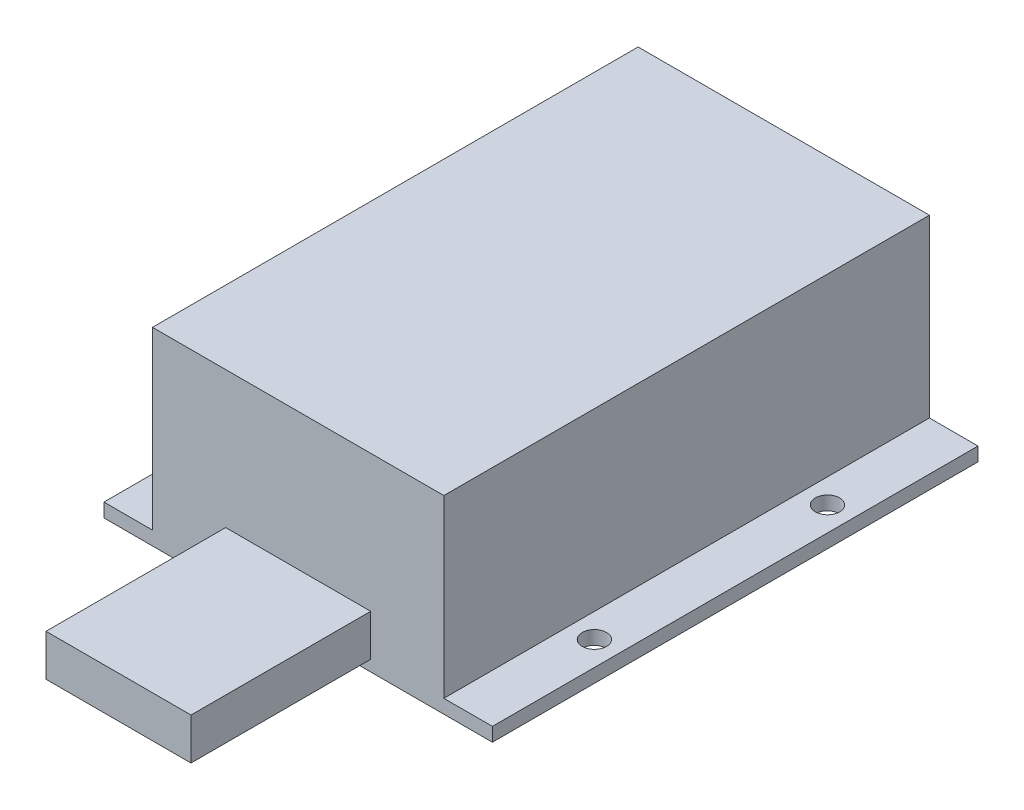
ISO-10303-21;
HEADER;
FILE_DESCRIPTION(('STEP AP214'),'2;1');
FILE_NAME('part.step','',(''),(''),'','','');
FILE_SCHEMA(('AUTOMOTIVE_DESIGN { 1 0 10303 214 1 1 1 1 }'));
ENDSEC;
DATA;
#1=APPLICATION_CONTEXT('core data for automotive mechanical design processes');
#2=APPLICATION_PROTOCOL_DEFINITION('international standard','automotive_design',2000,#1);
#3=PRODUCT_CONTEXT('',#1,'mechanical');
#4=PRODUCT('Part','Part','',(#3));
#5=PRODUCT_RELATED_PRODUCT_CATEGORY('part','',(#4));
#6=PRODUCT_DEFINITION_FORMATION('','',#4);
#7=PRODUCT_DEFINITION_CONTEXT('part definition',#1,'design');
#8=PRODUCT_DEFINITION('design','',#6,#7);
#9=PRODUCT_DEFINITION_SHAPE('','',#8);
#10=(LENGTH_UNIT() NAMED_UNIT(*) SI_UNIT(.MILLI.,.METRE.));
#11=(NAMED_UNIT(*) PLANE_ANGLE_UNIT() SI_UNIT($,.RADIAN.));
#12=(NAMED_UNIT(*) SI_UNIT($,.STERADIAN.) SOLID_ANGLE_UNIT());
#13=UNCERTAINTY_MEASURE_WITH_UNIT(LENGTH_MEASURE(1.E-05),#10,'distance_accuracy_value','');
#14=(GEOMETRIC_REPRESENTATION_CONTEXT(3) GLOBAL_UNCERTAINTY_ASSIGNED_CONTEXT((#13)) GLOBAL_UNIT_ASSIGNED_CONTEXT((#10,
#11,#12)) REPRESENTATION_CONTEXT('',''));
#15=CARTESIAN_POINT('',(0.,0.,0.));
#16=DIRECTION('',(0.,0.,1.));
#17=DIRECTION('',(1.,0.,0.));
#18=AXIS2_PLACEMENT_3D('',#15,#16,#17);
#19=CARTESIAN_POINT('',(0.,0.,50.));
#20=DIRECTION('',(0.,0.,1.));
#21=DIRECTION('',(1.,0.,0.));
#22=AXIS2_PLACEMENT_3D('',#19,#20,#21);
#23=PLANE('',#22);
#24=DIRECTION('',(0.,1.,0.));
#25=VECTOR('',#24,1.);
#26=CARTESIAN_POINT('',(40.,-16.6666666666667,50.));
#27=LINE('',#26,#25);
#28=CARTESIAN_POINT('',(40.,-19.5,50.));
#29=VERTEX_POINT('',#28);
#30=CARTESIAN_POINT('',(40.,-16.6666666666667,50.));
#31=VERTEX_POINT('',#30);
#32=EDGE_CURVE('E166',#29,#31,#27,.T.);
#33=ORIENTED_EDGE('',*,*,#32,.T.);
#34=DIRECTION('',(-1.,0.,0.));
#35=VECTOR('',#34,1.);
#36=CARTESIAN_POINT('',(30.,-16.6666666666667,50.));
#37=LINE('',#36,#35);
#38=CARTESIAN_POINT('',(30.,-16.6666666666667,50.));
#39=VERTEX_POINT('',#38);
#40=EDGE_CURVE('E106',#31,#39,#37,.T.);
#41=ORIENTED_EDGE('',*,*,#40,.T.);
#42=DIRECTION('',(0.,1.,0.));
#43=VECTOR('',#42,1.);
#44=CARTESIAN_POINT('',(30.,19.5,50.));
#45=LINE('',#44,#43);
#46=CARTESIAN_POINT('',(30.,19.5,50.));
#47=VERTEX_POINT('',#46);
#48=EDGE_CURVE('E181',#39,#47,#45,.T.);
#49=ORIENTED_EDGE('',*,*,#48,.T.);
#50=DIRECTION('',(-1.,0.,0.));
#51=VECTOR('',#50,1.);
#52=CARTESIAN_POINT('',(-30.,19.5,50.));
#53=LINE('',#52,#51);
#54=CARTESIAN_POINT('',(-30.,19.5,50.));
#55=VERTEX_POINT('',#54);
#56=EDGE_CURVE('E193',#47,#55,#53,.T.);
#57=ORIENTED_EDGE('',*,*,#56,.T.);
#58=DIRECTION('',(0.,-1.,0.));
#59=VECTOR('',#58,1.);
#60=CARTESIAN_POINT('',(-30.,19.5,50.));
#61=LINE('',#60,#59);
#62=CARTESIAN_POINT('',(-30.,-16.6666666666667,50.));
#63=VERTEX_POINT('',#62);
#64=EDGE_CURVE('E129',#55,#63,#61,.T.);
#65=ORIENTED_EDGE('',*,*,#64,.T.);
#66=DIRECTION('',(-1.,0.,0.));
#67=VECTOR('',#66,1.);
#68=CARTESIAN_POINT('',(-30.,-16.6666666666667,50.));
#69=LINE('',#68,#67);
#70=CARTESIAN_POINT('',(-40.,-16.6666666666667,50.));
#71=VERTEX_POINT('',#70);
#72=EDGE_CURVE('E122',#63,#71,#69,.T.);
#73=ORIENTED_EDGE('',*,*,#72,.T.);
#74=DIRECTION('',(0.,-1.,0.));
#75=VECTOR('',#74,1.);
#76=CARTESIAN_POINT('',(-40.,-16.6666666666667,50.));
#77=LINE('',#76,#75);
#78=CARTESIAN_POINT('',(-40.,-19.5,50.));
#79=VERTEX_POINT('',#78);
#80=EDGE_CURVE('E126',#71,#79,#77,.T.);
#81=ORIENTED_EDGE('',*,*,#80,.T.);
#82=DIRECTION('',(1.,0.,0.));
#83=VECTOR('',#82,1.);
#84=CARTESIAN_POINT('',(-40.,-19.5,50.));
#85=LINE('',#84,#83);
#86=EDGE_CURVE('E65',#79,#29,#85,.T.);
#87=ORIENTED_EDGE('',*,*,#86,.T.);
#88=EDGE_LOOP('',(#33,#41,#49,#57,#65,#73,#81,#87));
#89=FACE_BOUND('',#88,.T.);
#90=DIRECTION('',(-1.,0.,0.));
#91=VECTOR('',#90,1.);
#92=CARTESIAN_POINT('',(-14.931869746895,-8.67732997844512,50.));
#93=LINE('',#92,#91);
#94=CARTESIAN_POINT('',(14.931869746895,-8.67732997844512,50.));
#95=VERTEX_POINT('',#94);
#96=CARTESIAN_POINT('',(-14.931869746895,-8.67732997844512,50.));
#97=VERTEX_POINT('',#96);
#98=EDGE_CURVE('E238',#95,#97,#93,.T.);
#99=ORIENTED_EDGE('',*,*,#98,.F.);
#100=DIRECTION('',(0.,1.,0.));
#101=VECTOR('',#100,1.);
#102=CARTESIAN_POINT('',(14.931869746895,-8.67732997844512,50.));
#103=LINE('',#102,#101);
#104=CARTESIAN_POINT('',(14.931869746895,-17.241196450929,50.));
#105=VERTEX_POINT('',#104);
#106=EDGE_CURVE('E241',#105,#95,#103,.T.);
#107=ORIENTED_EDGE('',*,*,#106,.F.);
#108=DIRECTION('',(1.,0.,0.));
#109=VECTOR('',#108,1.);
#110=CARTESIAN_POINT('',(-14.931869746895,-17.241196450929,50.));
#111=LINE('',#110,#109);
#112=CARTESIAN_POINT('',(-14.931869746895,-17.241196450929,50.));
#113=VERTEX_POINT('',#112);
#114=EDGE_CURVE('E233',#113,#105,#111,.T.);
#115=ORIENTED_EDGE('',*,*,#114,.F.);
#116=DIRECTION('',(0.,-1.,0.));
#117=VECTOR('',#116,1.);
#118=CARTESIAN_POINT('',(-14.931869746895,-8.67732997844512,50.));
#119=LINE('',#118,#117);
#120=EDGE_CURVE('E236',#97,#113,#119,.T.);
#121=ORIENTED_EDGE('',*,*,#120,.F.);
#122=EDGE_LOOP('',(#99,#107,#115,#121));
#123=FACE_BOUND('',#122,.T.);
#124=ADVANCED_FACE('F41',(#89,#123),#23,.T.);
#125=CARTESIAN_POINT('',(40.,-16.6666666666667,50.));
#126=DIRECTION('',(-1.,0.,0.));
#127=DIRECTION('',(0.,-1.,0.));
#128=AXIS2_PLACEMENT_3D('',#125,#126,#127);
#129=PLANE('',#128);
#130=DIRECTION('',(0.,1.,0.));
#131=VECTOR('',#130,1.);
#132=CARTESIAN_POINT('',(40.,-16.6666666666667,-50.));
#133=LINE('',#132,#131);
#134=CARTESIAN_POINT('',(40.,-19.5,-50.));
#135=VERTEX_POINT('',#134);
#136=CARTESIAN_POINT('',(40.,-16.6666666666667,-50.));
#137=VERTEX_POINT('',#136);
#138=EDGE_CURVE('E150',#135,#137,#133,.T.);
#139=ORIENTED_EDGE('',*,*,#138,.T.);
#140=DIRECTION('',(0.,0.,-1.));
#141=VECTOR('',#140,1.);
#142=CARTESIAN_POINT('',(40.,-16.6666666666667,50.));
#143=LINE('',#142,#141);
#144=EDGE_CURVE('E11',#31,#137,#143,.T.);
#145=ORIENTED_EDGE('',*,*,#144,.F.);
#146=ORIENTED_EDGE('',*,*,#32,.F.);
#147=DIRECTION('',(0.,0.,-1.));
#148=VECTOR('',#147,1.);
#149=CARTESIAN_POINT('',(40.,-19.5,50.));
#150=LINE('',#149,#148);
#151=EDGE_CURVE('E146',#29,#135,#150,.T.);
#152=ORIENTED_EDGE('',*,*,#151,.T.);
#153=EDGE_LOOP('',(#139,#145,#146,#152));
#154=FACE_BOUND('',#153,.T.);
#155=ADVANCED_FACE('F43',(#154),#129,.F.);
#156=CARTESIAN_POINT('',(30.,-16.6666666666667,50.));
#157=DIRECTION('',(0.,-1.,0.));
#158=DIRECTION('',(0.,0.,-1.));
#159=AXIS2_PLACEMENT_3D('',#156,#157,#158);
#160=PLANE('',#159);
#161=CARTESIAN_POINT('',(35.,-16.6666666666667,-24.));
#162=DIRECTION('',(0.,1.,0.));
#163=DIRECTION('',(0.,0.,-1.));
#164=AXIS2_PLACEMENT_3D('',#161,#162,#163);
#165=CIRCLE('',#164,2.5);
#166=CARTESIAN_POINT('',(35.,-16.6666666666667,-21.5));
#167=VERTEX_POINT('',#166);
#168=EDGE_CURVE('E202',#167,#167,#165,.T.);
#169=ORIENTED_EDGE('',*,*,#168,.F.);
#170=EDGE_LOOP('',(#169));
#171=FACE_BOUND('',#170,.T.);
#172=CARTESIAN_POINT('',(35.,-16.6666666666667,24.));
#173=DIRECTION('',(0.,1.,0.));
#174=DIRECTION('',(0.,0.,-1.));
#175=AXIS2_PLACEMENT_3D('',#172,#173,#174);
#176=CIRCLE('',#175,2.5);
#177=CARTESIAN_POINT('',(35.,-16.6666666666667,26.5));
#178=VERTEX_POINT('',#177);
#179=EDGE_CURVE('E209',#178,#178,#176,.T.);
#180=ORIENTED_EDGE('',*,*,#179,.F.);
#181=EDGE_LOOP('',(#180));
#182=FACE_BOUND('',#181,.T.);
#183=DIRECTION('',(-1.,0.,0.));
#184=VECTOR('',#183,1.);
#185=CARTESIAN_POINT('',(30.,-16.6666666666667,-50.));
#186=LINE('',#185,#184);
#187=CARTESIAN_POINT('',(30.,-16.6666666666667,-50.));
#188=VERTEX_POINT('',#187);
#189=EDGE_CURVE('E153',#137,#188,#186,.T.);
#190=ORIENTED_EDGE('',*,*,#189,.T.);
#191=DIRECTION('',(0.,0.,-1.));
#192=VECTOR('',#191,1.);
#193=CARTESIAN_POINT('',(30.,-16.6666666666667,50.));
#194=LINE('',#193,#192);
#195=EDGE_CURVE('E49',#39,#188,#194,.T.);
#196=ORIENTED_EDGE('',*,*,#195,.F.);
#197=ORIENTED_EDGE('',*,*,#40,.F.);
#198=ORIENTED_EDGE('',*,*,#144,.T.);
#199=EDGE_LOOP('',(#190,#196,#197,#198));
#200=FACE_BOUND('',#199,.T.);
#201=ADVANCED_FACE('F289',(#171,#182,#200),#160,.F.);
#202=CARTESIAN_POINT('',(30.,19.5,50.));
#203=DIRECTION('',(-1.,0.,0.));
#204=DIRECTION('',(0.,-1.,0.));
#205=AXIS2_PLACEMENT_3D('',#202,#203,#204);
#206=PLANE('',#205);
#207=DIRECTION('',(0.,1.,0.));
#208=VECTOR('',#207,1.);
#209=CARTESIAN_POINT('',(30.,19.5,-50.));
#210=LINE('',#209,#208);
#211=CARTESIAN_POINT('',(30.,19.5,-50.));
#212=VERTEX_POINT('',#211);
#213=EDGE_CURVE('E156',#188,#212,#210,.T.);
#214=ORIENTED_EDGE('',*,*,#213,.T.);
#215=DIRECTION('',(0.,0.,-1.));
#216=VECTOR('',#215,1.);
#217=CARTESIAN_POINT('',(30.,19.5,50.));
#218=LINE('',#217,#216);
#219=EDGE_CURVE('E173',#47,#212,#218,.T.);
#220=ORIENTED_EDGE('',*,*,#219,.F.);
#221=ORIENTED_EDGE('',*,*,#48,.F.);
#222=ORIENTED_EDGE('',*,*,#195,.T.);
#223=EDGE_LOOP('',(#214,#220,#221,#222));
#224=FACE_BOUND('',#223,.T.);
#225=ADVANCED_FACE('F179',(#224),#206,.F.);
#226=CARTESIAN_POINT('',(-30.,19.5,50.));
#227=DIRECTION('',(0.,-1.,0.));
#228=DIRECTION('',(1.,0.,0.));
#229=AXIS2_PLACEMENT_3D('',#226,#227,#228);
#230=PLANE('',#229);
#231=DIRECTION('',(-1.,0.,0.));
#232=VECTOR('',#231,1.);
#233=CARTESIAN_POINT('',(-30.,19.5,-50.));
#234=LINE('',#233,#232);
#235=CARTESIAN_POINT('',(-30.,19.5,-50.));
#236=VERTEX_POINT('',#235);
#237=EDGE_CURVE('E158',#212,#236,#234,.T.);
#238=ORIENTED_EDGE('',*,*,#237,.T.);
#239=DIRECTION('',(0.,0.,-1.));
#240=VECTOR('',#239,1.);
#241=CARTESIAN_POINT('',(-30.,19.5,50.));
#242=LINE('',#241,#240);
#243=EDGE_CURVE('E170',#55,#236,#242,.T.);
#244=ORIENTED_EDGE('',*,*,#243,.F.);
#245=ORIENTED_EDGE('',*,*,#56,.F.);
#246=ORIENTED_EDGE('',*,*,#219,.T.);
#247=EDGE_LOOP('',(#238,#244,#245,#246));
#248=FACE_BOUND('',#247,.T.);
#249=ADVANCED_FACE('F189',(#248),#230,.F.);
#250=CARTESIAN_POINT('',(-30.,19.5,50.));
#251=DIRECTION('',(1.,0.,0.));
#252=DIRECTION('',(0.,0.,-1.));
#253=AXIS2_PLACEMENT_3D('',#250,#251,#252);
#254=PLANE('',#253);
#255=DIRECTION('',(0.,-1.,0.));
#256=VECTOR('',#255,1.);
#257=CARTESIAN_POINT('',(-30.,19.5,-50.));
#258=LINE('',#257,#256);
#259=CARTESIAN_POINT('',(-30.,-16.6666666666667,-50.));
#260=VERTEX_POINT('',#259);
#261=EDGE_CURVE('E160',#236,#260,#258,.T.);
#262=ORIENTED_EDGE('',*,*,#261,.T.);
#263=DIRECTION('',(0.,0.,-1.));
#264=VECTOR('',#263,1.);
#265=CARTESIAN_POINT('',(-30.,-16.6666666666667,50.));
#266=LINE('',#265,#264);
#267=EDGE_CURVE('E141',#63,#260,#266,.T.);
#268=ORIENTED_EDGE('',*,*,#267,.F.);
#269=ORIENTED_EDGE('',*,*,#64,.F.);
#270=ORIENTED_EDGE('',*,*,#243,.T.);
#271=EDGE_LOOP('',(#262,#268,#269,#270));
#272=FACE_BOUND('',#271,.T.);
#273=ADVANCED_FACE('F192',(#272),#254,.F.);
#274=CARTESIAN_POINT('',(-30.,-16.6666666666667,50.));
#275=DIRECTION('',(0.,-1.,0.));
#276=DIRECTION('',(0.,0.,-1.));
#277=AXIS2_PLACEMENT_3D('',#274,#275,#276);
#278=PLANE('',#277);
#279=CARTESIAN_POINT('',(-35.,-16.6666666666667,24.));
#280=DIRECTION('',(0.,1.,0.));
#281=DIRECTION('',(0.,0.,1.));
#282=AXIS2_PLACEMENT_3D('',#279,#280,#281);
#283=CIRCLE('',#282,2.5);
#284=CARTESIAN_POINT('',(-35.,-16.6666666666667,26.5));
#285=VERTEX_POINT('',#284);
#286=EDGE_CURVE('E208',#285,#285,#283,.T.);
#287=ORIENTED_EDGE('',*,*,#286,.F.);
#288=EDGE_LOOP('',(#287));
#289=FACE_BOUND('',#288,.T.);
#290=CARTESIAN_POINT('',(-35.,-16.6666666666667,-24.));
#291=DIRECTION('',(0.,1.,0.));
#292=DIRECTION('',(0.,0.,1.));
#293=AXIS2_PLACEMENT_3D('',#290,#291,#292);
#294=CIRCLE('',#293,2.5);
#295=CARTESIAN_POINT('',(-35.,-16.6666666666667,-21.5));
#296=VERTEX_POINT('',#295);
#297=EDGE_CURVE('E199',#296,#296,#294,.T.);
#298=ORIENTED_EDGE('',*,*,#297,.F.);
#299=EDGE_LOOP('',(#298));
#300=FACE_BOUND('',#299,.T.);
#301=DIRECTION('',(-1.,0.,0.));
#302=VECTOR('',#301,1.);
#303=CARTESIAN_POINT('',(-30.,-16.6666666666667,-50.));
#304=LINE('',#303,#302);
#305=CARTESIAN_POINT('',(-40.,-16.6666666666667,-50.));
#306=VERTEX_POINT('',#305);
#307=EDGE_CURVE('E138',#260,#306,#304,.T.);
#308=ORIENTED_EDGE('',*,*,#307,.T.);
#309=DIRECTION('',(0.,0.,-1.));
#310=VECTOR('',#309,1.);
#311=CARTESIAN_POINT('',(-40.,-16.6666666666667,50.));
#312=LINE('',#311,#310);
#313=EDGE_CURVE('E135',#71,#306,#312,.T.);
#314=ORIENTED_EDGE('',*,*,#313,.F.);
#315=ORIENTED_EDGE('',*,*,#72,.F.);
#316=ORIENTED_EDGE('',*,*,#267,.T.);
#317=EDGE_LOOP('',(#308,#314,#315,#316));
#318=FACE_BOUND('',#317,.T.);
#319=ADVANCED_FACE('F136',(#289,#300,#318),#278,.F.);
#320=CARTESIAN_POINT('',(-40.,-16.6666666666667,50.));
#321=DIRECTION('',(1.,0.,0.));
#322=DIRECTION('',(0.,0.,-1.));
#323=AXIS2_PLACEMENT_3D('',#320,#321,#322);
#324=PLANE('',#323);
#325=DIRECTION('',(0.,-1.,0.));
#326=VECTOR('',#325,1.);
#327=CARTESIAN_POINT('',(-40.,-16.6666666666667,-50.));
#328=LINE('',#327,#326);
#329=CARTESIAN_POINT('',(-40.,-19.5,-50.));
#330=VERTEX_POINT('',#329);
#331=EDGE_CURVE('E163',#306,#330,#328,.T.);
#332=ORIENTED_EDGE('',*,*,#331,.T.);
#333=DIRECTION('',(0.,0.,-1.));
#334=VECTOR('',#333,1.);
#335=CARTESIAN_POINT('',(-40.,-19.5,50.));
#336=LINE('',#335,#334);
#337=EDGE_CURVE('E142',#79,#330,#336,.T.);
#338=ORIENTED_EDGE('',*,*,#337,.F.);
#339=ORIENTED_EDGE('',*,*,#80,.F.);
#340=ORIENTED_EDGE('',*,*,#313,.T.);
#341=EDGE_LOOP('',(#332,#338,#339,#340));
#342=FACE_BOUND('',#341,.T.);
#343=ADVANCED_FACE('F144',(#342),#324,.F.);
#344=CARTESIAN_POINT('',(-40.,-19.5,50.));
#345=DIRECTION('',(0.,1.,0.));
#346=DIRECTION('',(0.,0.,1.));
#347=AXIS2_PLACEMENT_3D('',#344,#345,#346);
#348=PLANE('',#347);
#349=CARTESIAN_POINT('',(35.,-19.5,-24.));
#350=DIRECTION('',(0.,1.,0.));
#351=DIRECTION('',(0.,0.,-1.));
#352=AXIS2_PLACEMENT_3D('',#349,#350,#351);
#353=CIRCLE('',#352,2.5);
#354=CARTESIAN_POINT('',(35.,-19.5,-21.5));
#355=VERTEX_POINT('',#354);
#356=EDGE_CURVE('E212',#355,#355,#353,.T.);
#357=ORIENTED_EDGE('',*,*,#356,.T.);
#358=EDGE_LOOP('',(#357));
#359=FACE_BOUND('',#358,.T.);
#360=CARTESIAN_POINT('',(-35.,-19.5,24.));
#361=DIRECTION('',(0.,1.,0.));
#362=DIRECTION('',(0.,0.,1.));
#363=AXIS2_PLACEMENT_3D('',#360,#361,#362);
#364=CIRCLE('',#363,2.5);
#365=CARTESIAN_POINT('',(-35.,-19.5,26.5));
#366=VERTEX_POINT('',#365);
#367=EDGE_CURVE('E205',#366,#366,#364,.T.);
#368=ORIENTED_EDGE('',*,*,#367,.T.);
#369=EDGE_LOOP('',(#368));
#370=FACE_BOUND('',#369,.T.);
#371=CARTESIAN_POINT('',(35.,-19.5,24.));
#372=DIRECTION('',(0.,1.,0.));
#373=DIRECTION('',(0.,0.,-1.));
#374=AXIS2_PLACEMENT_3D('',#371,#372,#373);
#375=CIRCLE('',#374,2.5);
#376=CARTESIAN_POINT('',(35.,-19.5,26.5));
#377=VERTEX_POINT('',#376);
#378=EDGE_CURVE('E217',#377,#377,#375,.T.);
#379=ORIENTED_EDGE('',*,*,#378,.T.);
#380=EDGE_LOOP('',(#379));
#381=FACE_BOUND('',#380,.T.);
#382=CARTESIAN_POINT('',(-35.,-19.5,-24.));
#383=DIRECTION('',(0.,1.,0.));
#384=DIRECTION('',(0.,0.,1.));
#385=AXIS2_PLACEMENT_3D('',#382,#383,#384);
#386=CIRCLE('',#385,2.5);
#387=CARTESIAN_POINT('',(-35.,-19.5,-21.5));
#388=VERTEX_POINT('',#387);
#389=EDGE_CURVE('E154',#388,#388,#386,.T.);
#390=ORIENTED_EDGE('',*,*,#389,.T.);
#391=EDGE_LOOP('',(#390));
#392=FACE_BOUND('',#391,.T.);
#393=DIRECTION('',(1.,0.,0.));
#394=VECTOR('',#393,1.);
#395=CARTESIAN_POINT('',(-40.,-19.5,-50.));
#396=LINE('',#395,#394);
#397=EDGE_CURVE('E98',#330,#135,#396,.T.);
#398=ORIENTED_EDGE('',*,*,#397,.T.);
#399=ORIENTED_EDGE('',*,*,#151,.F.);
#400=ORIENTED_EDGE('',*,*,#86,.F.);
#401=ORIENTED_EDGE('',*,*,#337,.T.);
#402=EDGE_LOOP('',(#398,#399,#400,#401));
#403=FACE_BOUND('',#402,.T.);
#404=ADVANCED_FACE('F297',(#359,#370,#381,#392,#403),#348,.F.);
#405=CARTESIAN_POINT('',(0.,0.,-50.));
#406=DIRECTION('',(0.,0.,1.));
#407=DIRECTION('',(1.,0.,0.));
#408=AXIS2_PLACEMENT_3D('',#405,#406,#407);
#409=PLANE('',#408);
#410=ORIENTED_EDGE('',*,*,#138,.F.);
#411=ORIENTED_EDGE('',*,*,#397,.F.);
#412=ORIENTED_EDGE('',*,*,#331,.F.);
#413=ORIENTED_EDGE('',*,*,#307,.F.);
#414=ORIENTED_EDGE('',*,*,#261,.F.);
#415=ORIENTED_EDGE('',*,*,#237,.F.);
#416=ORIENTED_EDGE('',*,*,#213,.F.);
#417=ORIENTED_EDGE('',*,*,#189,.F.);
#418=EDGE_LOOP('',(#410,#411,#412,#413,#414,#415,#416,#417));
#419=FACE_BOUND('',#418,.T.);
#420=ADVANCED_FACE('F185',(#419),#409,.F.);
#421=CARTESIAN_POINT('',(-35.,-19.5,-24.));
#422=DIRECTION('',(0.,1.,0.));
#423=DIRECTION('',(0.,0.,1.));
#424=AXIS2_PLACEMENT_3D('',#421,#422,#423);
#425=CYLINDRICAL_SURFACE('',#424,2.5);
#426=CARTESIAN_POINT('',(-35.,-19.5,-21.5));
#427=CARTESIAN_POINT('',(-35.,-19.4704861111111,-21.5));
#428=CARTESIAN_POINT('',(-35.,-19.4409722222222,-21.5));
#429=CARTESIAN_POINT('',(-35.,-19.3819444444444,-21.5));
#430=CARTESIAN_POINT('',(-35.,-19.3524305555556,-21.5));
#431=CARTESIAN_POINT('',(-35.,-19.2934027777778,-21.5));
#432=CARTESIAN_POINT('',(-35.,-19.2638888888889,-21.5));
#433=CARTESIAN_POINT('',(-35.,-19.2048611111111,-21.5));
#434=CARTESIAN_POINT('',(-35.,-19.1753472222222,-21.5));
#435=CARTESIAN_POINT('',(-35.,-19.1163194444444,-21.5));
#436=CARTESIAN_POINT('',(-35.,-19.0868055555556,-21.5));
#437=CARTESIAN_POINT('',(-35.,-19.0277777777778,-21.5));
#438=CARTESIAN_POINT('',(-35.,-18.9982638888889,-21.5));
#439=CARTESIAN_POINT('',(-35.,-18.9392361111111,-21.5));
#440=CARTESIAN_POINT('',(-35.,-18.9097222222222,-21.5));
#441=CARTESIAN_POINT('',(-35.,-18.8506944444444,-21.5));
#442=CARTESIAN_POINT('',(-35.,-18.8211805555556,-21.5));
#443=CARTESIAN_POINT('',(-35.,-18.7621527777778,-21.5));
#444=CARTESIAN_POINT('',(-35.,-18.7326388888889,-21.5));
#445=CARTESIAN_POINT('',(-35.,-18.6736111111111,-21.5));
#446=CARTESIAN_POINT('',(-35.,-18.6440972222222,-21.5));
#447=CARTESIAN_POINT('',(-35.,-18.5850694444444,-21.5));
#448=CARTESIAN_POINT('',(-35.,-18.5555555555556,-21.5));
#449=CARTESIAN_POINT('',(-35.,-18.4965277777778,-21.5));
#450=CARTESIAN_POINT('',(-35.,-18.4670138888889,-21.5));
#451=CARTESIAN_POINT('',(-35.,-18.4079861111111,-21.5));
#452=CARTESIAN_POINT('',(-35.,-18.3784722222222,-21.5));
#453=CARTESIAN_POINT('',(-35.,-18.3194444444444,-21.5));
#454=CARTESIAN_POINT('',(-35.,-18.2899305555556,-21.5));
#455=CARTESIAN_POINT('',(-35.,-18.2309027777778,-21.5));
#456=CARTESIAN_POINT('',(-35.,-18.2013888888889,-21.5));
#457=CARTESIAN_POINT('',(-35.,-18.1423611111111,-21.5));
#458=CARTESIAN_POINT('',(-35.,-18.1128472222222,-21.5));
#459=CARTESIAN_POINT('',(-35.,-18.0538194444444,-21.5));
#460=CARTESIAN_POINT('',(-35.,-18.0243055555556,-21.5));
#461=CARTESIAN_POINT('',(-35.,-17.9652777777778,-21.5));
#462=CARTESIAN_POINT('',(-35.,-17.9357638888889,-21.5));
#463=CARTESIAN_POINT('',(-35.,-17.8767361111111,-21.5));
#464=CARTESIAN_POINT('',(-35.,-17.8472222222222,-21.5));
#465=CARTESIAN_POINT('',(-35.,-17.7881944444444,-21.5));
#466=CARTESIAN_POINT('',(-35.,-17.7586805555556,-21.5));
#467=CARTESIAN_POINT('',(-35.,-17.6996527777778,-21.5));
#468=CARTESIAN_POINT('',(-35.,-17.6701388888889,-21.5));
#469=CARTESIAN_POINT('',(-35.,-17.6111111111111,-21.5));
#470=CARTESIAN_POINT('',(-35.,-17.5815972222222,-21.5));
#471=CARTESIAN_POINT('',(-35.,-17.5225694444444,-21.5));
#472=CARTESIAN_POINT('',(-35.,-17.4930555555556,-21.5));
#473=CARTESIAN_POINT('',(-35.,-17.4340277777778,-21.5));
#474=CARTESIAN_POINT('',(-35.,-17.4045138888889,-21.5));
#475=CARTESIAN_POINT('',(-35.,-17.3454861111111,-21.5));
#476=CARTESIAN_POINT('',(-35.,-17.3159722222222,-21.5));
#477=CARTESIAN_POINT('',(-35.,-17.2569444444444,-21.5));
#478=CARTESIAN_POINT('',(-35.,-17.2274305555556,-21.5));
#479=CARTESIAN_POINT('',(-35.,-17.1684027777778,-21.5));
#480=CARTESIAN_POINT('',(-35.,-17.1388888888889,-21.5));
#481=CARTESIAN_POINT('',(-35.,-17.0798611111111,-21.5));
#482=CARTESIAN_POINT('',(-35.,-17.0503472222222,-21.5));
#483=CARTESIAN_POINT('',(-35.,-16.9913194444444,-21.5));
#484=CARTESIAN_POINT('',(-35.,-16.9618055555556,-21.5));
#485=CARTESIAN_POINT('',(-35.,-16.9027777777778,-21.5));
#486=CARTESIAN_POINT('',(-35.,-16.8732638888889,-21.5));
#487=CARTESIAN_POINT('',(-35.,-16.8142361111111,-21.5));
#488=CARTESIAN_POINT('',(-35.,-16.7847222222222,-21.5));
#489=CARTESIAN_POINT('',(-35.,-16.7256944444445,-21.5));
#490=CARTESIAN_POINT('',(-35.,-16.6961805555556,-21.5));
#491=CARTESIAN_POINT('',(-35.,-16.6666666666667,-21.5));
#492=B_SPLINE_CURVE_WITH_KNOTS('',3,(#426,#427,#428,#429,#430,#431,#432,#433,#434,#435,#436,
#437,#438,#439,#440,#441,#442,#443,#444,#445,#446,#447,#448,#449,#450,#451,#452,#453,#454,#455,
#456,#457,#458,#459,#460,#461,#462,#463,#464,#465,#466,#467,#468,#469,#470,#471,#472,#473,#474,
#475,#476,#477,#478,#479,#480,#481,#482,#483,#484,#485,#486,#487,#488,#489,#490,#491),
.UNSPECIFIED.,.F.,.F.,(4,2,2,2,2,2,2,2,2,2,2,2,2,2,2,2,2,2,2,2,2,2,2,2,2,2,2,2,2,2,2,2,4),(0.,
0.0885416666666639,0.177083333333331,0.265624999999999,0.354166666666662,0.44270833333333,
0.531249999999997,0.619791666666664,0.708333333333328,0.796874999999996,0.885416666666663,
0.973958333333327,1.06249999999999,1.15104166666666,1.23958333333333,1.32812499999999,
1.41666666666666,1.50520833333333,1.59374999999999,1.68229166666666,1.77083333333333,
1.85937499999999,1.94791666666666,2.03645833333332,2.12499999999999,2.21354166666666,
2.30208333333332,2.39062499999999,2.47916666666666,2.56770833333332,2.65624999999999,
2.74479166666666,2.83333333333332),.UNSPECIFIED.);
#493=EDGE_CURVE('BSEAM293',#388,#296,#492,.T.);
#494=ORIENTED_EDGE('',*,*,#389,.F.);
#495=ORIENTED_EDGE('',*,*,#297,.T.);
#496=ORIENTED_EDGE('',*,*,#493,.T.);
#497=ORIENTED_EDGE('',*,*,#493,.F.);
#498=EDGE_LOOP('',(#494,#496,#495,#497));
#499=FACE_BOUND('',#498,.T.);
#500=ADVANCED_FACE('F293',(#499),#425,.F.);
#501=CARTESIAN_POINT('',(35.,-19.5,24.));
#502=DIRECTION('',(0.,1.,0.));
#503=DIRECTION('',(0.,0.,1.));
#504=AXIS2_PLACEMENT_3D('',#501,#502,#503);
#505=CYLINDRICAL_SURFACE('',#504,2.5);
#506=CARTESIAN_POINT('',(35.,-19.5,26.5));
#507=CARTESIAN_POINT('',(35.,-19.4704861111111,26.5));
#508=CARTESIAN_POINT('',(35.,-19.4409722222222,26.5));
#509=CARTESIAN_POINT('',(35.,-19.3819444444444,26.5));
#510=CARTESIAN_POINT('',(35.,-19.3524305555556,26.5));
#511=CARTESIAN_POINT('',(35.,-19.2934027777778,26.5));
#512=CARTESIAN_POINT('',(35.,-19.2638888888889,26.5));
#513=CARTESIAN_POINT('',(35.,-19.2048611111111,26.5));
#514=CARTESIAN_POINT('',(35.,-19.1753472222222,26.5));
#515=CARTESIAN_POINT('',(35.,-19.1163194444444,26.5));
#516=CARTESIAN_POINT('',(35.,-19.0868055555556,26.5));
#517=CARTESIAN_POINT('',(35.,-19.0277777777778,26.5));
#518=CARTESIAN_POINT('',(35.,-18.9982638888889,26.5));
#519=CARTESIAN_POINT('',(35.,-18.9392361111111,26.5));
#520=CARTESIAN_POINT('',(35.,-18.9097222222222,26.5));
#521=CARTESIAN_POINT('',(35.,-18.8506944444444,26.5));
#522=CARTESIAN_POINT('',(35.,-18.8211805555556,26.5));
#523=CARTESIAN_POINT('',(35.,-18.7621527777778,26.5));
#524=CARTESIAN_POINT('',(35.,-18.7326388888889,26.5));
#525=CARTESIAN_POINT('',(35.,-18.6736111111111,26.5));
#526=CARTESIAN_POINT('',(35.,-18.6440972222222,26.5));
#527=CARTESIAN_POINT('',(35.,-18.5850694444444,26.5));
#528=CARTESIAN_POINT('',(35.,-18.5555555555556,26.5));
#529=CARTESIAN_POINT('',(35.,-18.4965277777778,26.5));
#530=CARTESIAN_POINT('',(35.,-18.4670138888889,26.5));
#531=CARTESIAN_POINT('',(35.,-18.4079861111111,26.5));
#532=CARTESIAN_POINT('',(35.,-18.3784722222222,26.5));
#533=CARTESIAN_POINT('',(35.,-18.3194444444444,26.5));
#534=CARTESIAN_POINT('',(35.,-18.2899305555556,26.5));
#535=CARTESIAN_POINT('',(35.,-18.2309027777778,26.5));
#536=CARTESIAN_POINT('',(35.,-18.2013888888889,26.5));
#537=CARTESIAN_POINT('',(35.,-18.1423611111111,26.5));
#538=CARTESIAN_POINT('',(35.,-18.1128472222222,26.5));
#539=CARTESIAN_POINT('',(35.,-18.0538194444444,26.5));
#540=CARTESIAN_POINT('',(35.,-18.0243055555556,26.5));
#541=CARTESIAN_POINT('',(35.,-17.9652777777778,26.5));
#542=CARTESIAN_POINT('',(35.,-17.9357638888889,26.5));
#543=CARTESIAN_POINT('',(35.,-17.8767361111111,26.5));
#544=CARTESIAN_POINT('',(35.,-17.8472222222222,26.5));
#545=CARTESIAN_POINT('',(35.,-17.7881944444444,26.5));
#546=CARTESIAN_POINT('',(35.,-17.7586805555556,26.5));
#547=CARTESIAN_POINT('',(35.,-17.6996527777778,26.5));
#548=CARTESIAN_POINT('',(35.,-17.6701388888889,26.5));
#549=CARTESIAN_POINT('',(35.,-17.6111111111111,26.5));
#550=CARTESIAN_POINT('',(35.,-17.5815972222222,26.5));
#551=CARTESIAN_POINT('',(35.,-17.5225694444444,26.5));
#552=CARTESIAN_POINT('',(35.,-17.4930555555556,26.5));
#553=CARTESIAN_POINT('',(35.,-17.4340277777778,26.5));
#554=CARTESIAN_POINT('',(35.,-17.4045138888889,26.5));
#555=CARTESIAN_POINT('',(35.,-17.3454861111111,26.5));
#556=CARTESIAN_POINT('',(35.,-17.3159722222222,26.5));
#557=CARTESIAN_POINT('',(35.,-17.2569444444444,26.5));
#558=CARTESIAN_POINT('',(35.,-17.2274305555556,26.5));
#559=CARTESIAN_POINT('',(35.,-17.1684027777778,26.5));
#560=CARTESIAN_POINT('',(35.,-17.1388888888889,26.5));
#561=CARTESIAN_POINT('',(35.,-17.0798611111111,26.5));
#562=CARTESIAN_POINT('',(35.,-17.0503472222222,26.5));
#563=CARTESIAN_POINT('',(35.,-16.9913194444444,26.5));
#564=CARTESIAN_POINT('',(35.,-16.9618055555556,26.5));
#565=CARTESIAN_POINT('',(35.,-16.9027777777778,26.5));
#566=CARTESIAN_POINT('',(35.,-16.8732638888889,26.5));
#567=CARTESIAN_POINT('',(35.,-16.8142361111111,26.5));
#568=CARTESIAN_POINT('',(35.,-16.7847222222222,26.5));
#569=CARTESIAN_POINT('',(35.,-16.7256944444445,26.5));
#570=CARTESIAN_POINT('',(35.,-16.6961805555556,26.5));
#571=CARTESIAN_POINT('',(35.,-16.6666666666667,26.5));
#572=B_SPLINE_CURVE_WITH_KNOTS('',3,(#506,#507,#508,#509,#510,#511,#512,#513,#514,#515,#516,
#517,#518,#519,#520,#521,#522,#523,#524,#525,#526,#527,#528,#529,#530,#531,#532,#533,#534,#535,
#536,#537,#538,#539,#540,#541,#542,#543,#544,#545,#546,#547,#548,#549,#550,#551,#552,#553,#554,
#555,#556,#557,#558,#559,#560,#561,#562,#563,#564,#565,#566,#567,#568,#569,#570,#571),
.UNSPECIFIED.,.F.,.F.,(4,2,2,2,2,2,2,2,2,2,2,2,2,2,2,2,2,2,2,2,2,2,2,2,2,2,2,2,2,2,2,2,4),(0.,
0.0885416666666639,0.177083333333331,0.265624999999999,0.354166666666662,0.44270833333333,
0.531249999999997,0.619791666666664,0.708333333333328,0.796874999999996,0.885416666666663,
0.973958333333327,1.06249999999999,1.15104166666666,1.23958333333333,1.32812499999999,
1.41666666666666,1.50520833333333,1.59374999999999,1.68229166666666,1.77083333333333,
1.85937499999999,1.94791666666666,2.03645833333332,2.12499999999999,2.21354166666666,
2.30208333333332,2.39062499999999,2.47916666666666,2.56770833333332,2.65624999999999,
2.74479166666666,2.83333333333332),.UNSPECIFIED.);
#573=EDGE_CURVE('BSEAM321',#377,#178,#572,.T.);
#574=ORIENTED_EDGE('',*,*,#378,.F.);
#575=ORIENTED_EDGE('',*,*,#179,.T.);
#576=ORIENTED_EDGE('',*,*,#573,.T.);
#577=ORIENTED_EDGE('',*,*,#573,.F.);
#578=EDGE_LOOP('',(#574,#576,#575,#577));
#579=FACE_BOUND('',#578,.T.);
#580=ADVANCED_FACE('F321',(#579),#505,.F.);
#581=CARTESIAN_POINT('',(-35.,-19.5,24.));
#582=DIRECTION('',(0.,1.,0.));
#583=DIRECTION('',(0.,0.,1.));
#584=AXIS2_PLACEMENT_3D('',#581,#582,#583);
#585=CYLINDRICAL_SURFACE('',#584,2.5);
#586=CARTESIAN_POINT('',(-35.,-19.5,26.5));
#587=CARTESIAN_POINT('',(-35.,-19.4704861111111,26.5));
#588=CARTESIAN_POINT('',(-35.,-19.4409722222222,26.5));
#589=CARTESIAN_POINT('',(-35.,-19.3819444444444,26.5));
#590=CARTESIAN_POINT('',(-35.,-19.3524305555556,26.5));
#591=CARTESIAN_POINT('',(-35.,-19.2934027777778,26.5));
#592=CARTESIAN_POINT('',(-35.,-19.2638888888889,26.5));
#593=CARTESIAN_POINT('',(-35.,-19.2048611111111,26.5));
#594=CARTESIAN_POINT('',(-35.,-19.1753472222222,26.5));
#595=CARTESIAN_POINT('',(-35.,-19.1163194444444,26.5));
#596=CARTESIAN_POINT('',(-35.,-19.0868055555556,26.5));
#597=CARTESIAN_POINT('',(-35.,-19.0277777777778,26.5));
#598=CARTESIAN_POINT('',(-35.,-18.9982638888889,26.5));
#599=CARTESIAN_POINT('',(-35.,-18.9392361111111,26.5));
#600=CARTESIAN_POINT('',(-35.,-18.9097222222222,26.5));
#601=CARTESIAN_POINT('',(-35.,-18.8506944444444,26.5));
#602=CARTESIAN_POINT('',(-35.,-18.8211805555556,26.5));
#603=CARTESIAN_POINT('',(-35.,-18.7621527777778,26.5));
#604=CARTESIAN_POINT('',(-35.,-18.7326388888889,26.5));
#605=CARTESIAN_POINT('',(-35.,-18.6736111111111,26.5));
#606=CARTESIAN_POINT('',(-35.,-18.6440972222222,26.5));
#607=CARTESIAN_POINT('',(-35.,-18.5850694444444,26.5));
#608=CARTESIAN_POINT('',(-35.,-18.5555555555556,26.5));
#609=CARTESIAN_POINT('',(-35.,-18.4965277777778,26.5));
#610=CARTESIAN_POINT('',(-35.,-18.4670138888889,26.5));
#611=CARTESIAN_POINT('',(-35.,-18.4079861111111,26.5));
#612=CARTESIAN_POINT('',(-35.,-18.3784722222222,26.5));
#613=CARTESIAN_POINT('',(-35.,-18.3194444444444,26.5));
#614=CARTESIAN_POINT('',(-35.,-18.2899305555556,26.5));
#615=CARTESIAN_POINT('',(-35.,-18.2309027777778,26.5));
#616=CARTESIAN_POINT('',(-35.,-18.2013888888889,26.5));
#617=CARTESIAN_POINT('',(-35.,-18.1423611111111,26.5));
#618=CARTESIAN_POINT('',(-35.,-18.1128472222222,26.5));
#619=CARTESIAN_POINT('',(-35.,-18.0538194444444,26.5));
#620=CARTESIAN_POINT('',(-35.,-18.0243055555556,26.5));
#621=CARTESIAN_POINT('',(-35.,-17.9652777777778,26.5));
#622=CARTESIAN_POINT('',(-35.,-17.9357638888889,26.5));
#623=CARTESIAN_POINT('',(-35.,-17.8767361111111,26.5));
#624=CARTESIAN_POINT('',(-35.,-17.8472222222222,26.5));
#625=CARTESIAN_POINT('',(-35.,-17.7881944444444,26.5));
#626=CARTESIAN_POINT('',(-35.,-17.7586805555556,26.5));
#627=CARTESIAN_POINT('',(-35.,-17.6996527777778,26.5));
#628=CARTESIAN_POINT('',(-35.,-17.6701388888889,26.5));
#629=CARTESIAN_POINT('',(-35.,-17.6111111111111,26.5));
#630=CARTESIAN_POINT('',(-35.,-17.5815972222222,26.5));
#631=CARTESIAN_POINT('',(-35.,-17.5225694444444,26.5));
#632=CARTESIAN_POINT('',(-35.,-17.4930555555556,26.5));
#633=CARTESIAN_POINT('',(-35.,-17.4340277777778,26.5));
#634=CARTESIAN_POINT('',(-35.,-17.4045138888889,26.5));
#635=CARTESIAN_POINT('',(-35.,-17.3454861111111,26.5));
#636=CARTESIAN_POINT('',(-35.,-17.3159722222222,26.5));
#637=CARTESIAN_POINT('',(-35.,-17.2569444444444,26.5));
#638=CARTESIAN_POINT('',(-35.,-17.2274305555556,26.5));
#639=CARTESIAN_POINT('',(-35.,-17.1684027777778,26.5));
#640=CARTESIAN_POINT('',(-35.,-17.1388888888889,26.5));
#641=CARTESIAN_POINT('',(-35.,-17.0798611111111,26.5));
#642=CARTESIAN_POINT('',(-35.,-17.0503472222222,26.5));
#643=CARTESIAN_POINT('',(-35.,-16.9913194444444,26.5));
#644=CARTESIAN_POINT('',(-35.,-16.9618055555556,26.5));
#645=CARTESIAN_POINT('',(-35.,-16.9027777777778,26.5));
#646=CARTESIAN_POINT('',(-35.,-16.8732638888889,26.5));
#647=CARTESIAN_POINT('',(-35.,-16.8142361111111,26.5));
#648=CARTESIAN_POINT('',(-35.,-16.7847222222222,26.5));
#649=CARTESIAN_POINT('',(-35.,-16.7256944444445,26.5));
#650=CARTESIAN_POINT('',(-35.,-16.6961805555556,26.5));
#651=CARTESIAN_POINT('',(-35.,-16.6666666666667,26.5));
#652=B_SPLINE_CURVE_WITH_KNOTS('',3,(#586,#587,#588,#589,#590,#591,#592,#593,#594,#595,#596,
#597,#598,#599,#600,#601,#602,#603,#604,#605,#606,#607,#608,#609,#610,#611,#612,#613,#614,#615,
#616,#617,#618,#619,#620,#621,#622,#623,#624,#625,#626,#627,#628,#629,#630,#631,#632,#633,#634,
#635,#636,#637,#638,#639,#640,#641,#642,#643,#644,#645,#646,#647,#648,#649,#650,#651),
.UNSPECIFIED.,.F.,.F.,(4,2,2,2,2,2,2,2,2,2,2,2,2,2,2,2,2,2,2,2,2,2,2,2,2,2,2,2,2,2,2,2,4),(0.,
0.0885416666666639,0.177083333333331,0.265624999999999,0.354166666666662,0.44270833333333,
0.531249999999997,0.619791666666664,0.708333333333328,0.796874999999996,0.885416666666663,
0.973958333333327,1.06249999999999,1.15104166666666,1.23958333333333,1.32812499999999,
1.41666666666666,1.50520833333333,1.59374999999999,1.68229166666666,1.77083333333333,
1.85937499999999,1.94791666666666,2.03645833333332,2.12499999999999,2.21354166666666,
2.30208333333332,2.39062499999999,2.47916666666666,2.56770833333332,2.65624999999999,
2.74479166666666,2.83333333333332),.UNSPECIFIED.);
#653=EDGE_CURVE('BSEAM323',#366,#285,#652,.T.);
#654=ORIENTED_EDGE('',*,*,#367,.F.);
#655=ORIENTED_EDGE('',*,*,#286,.T.);
#656=ORIENTED_EDGE('',*,*,#653,.T.);
#657=ORIENTED_EDGE('',*,*,#653,.F.);
#658=EDGE_LOOP('',(#654,#656,#655,#657));
#659=FACE_BOUND('',#658,.T.);
#660=ADVANCED_FACE('F323',(#659),#585,.F.);
#661=CARTESIAN_POINT('',(35.,-19.5,-24.));
#662=DIRECTION('',(0.,1.,0.));
#663=DIRECTION('',(0.,0.,1.));
#664=AXIS2_PLACEMENT_3D('',#661,#662,#663);
#665=CYLINDRICAL_SURFACE('',#664,2.5);
#666=CARTESIAN_POINT('',(35.,-19.5,-21.5));
#667=CARTESIAN_POINT('',(35.,-19.4704861111111,-21.5));
#668=CARTESIAN_POINT('',(35.,-19.4409722222222,-21.5));
#669=CARTESIAN_POINT('',(35.,-19.3819444444444,-21.5));
#670=CARTESIAN_POINT('',(35.,-19.3524305555556,-21.5));
#671=CARTESIAN_POINT('',(35.,-19.2934027777778,-21.5));
#672=CARTESIAN_POINT('',(35.,-19.2638888888889,-21.5));
#673=CARTESIAN_POINT('',(35.,-19.2048611111111,-21.5));
#674=CARTESIAN_POINT('',(35.,-19.1753472222222,-21.5));
#675=CARTESIAN_POINT('',(35.,-19.1163194444444,-21.5));
#676=CARTESIAN_POINT('',(35.,-19.0868055555556,-21.5));
#677=CARTESIAN_POINT('',(35.,-19.0277777777778,-21.5));
#678=CARTESIAN_POINT('',(35.,-18.9982638888889,-21.5));
#679=CARTESIAN_POINT('',(35.,-18.9392361111111,-21.5));
#680=CARTESIAN_POINT('',(35.,-18.9097222222222,-21.5));
#681=CARTESIAN_POINT('',(35.,-18.8506944444444,-21.5));
#682=CARTESIAN_POINT('',(35.,-18.8211805555556,-21.5));
#683=CARTESIAN_POINT('',(35.,-18.7621527777778,-21.5));
#684=CARTESIAN_POINT('',(35.,-18.7326388888889,-21.5));
#685=CARTESIAN_POINT('',(35.,-18.6736111111111,-21.5));
#686=CARTESIAN_POINT('',(35.,-18.6440972222222,-21.5));
#687=CARTESIAN_POINT('',(35.,-18.5850694444444,-21.5));
#688=CARTESIAN_POINT('',(35.,-18.5555555555556,-21.5));
#689=CARTESIAN_POINT('',(35.,-18.4965277777778,-21.5));
#690=CARTESIAN_POINT('',(35.,-18.4670138888889,-21.5));
#691=CARTESIAN_POINT('',(35.,-18.4079861111111,-21.5));
#692=CARTESIAN_POINT('',(35.,-18.3784722222222,-21.5));
#693=CARTESIAN_POINT('',(35.,-18.3194444444444,-21.5));
#694=CARTESIAN_POINT('',(35.,-18.2899305555556,-21.5));
#695=CARTESIAN_POINT('',(35.,-18.2309027777778,-21.5));
#696=CARTESIAN_POINT('',(35.,-18.2013888888889,-21.5));
#697=CARTESIAN_POINT('',(35.,-18.1423611111111,-21.5));
#698=CARTESIAN_POINT('',(35.,-18.1128472222222,-21.5));
#699=CARTESIAN_POINT('',(35.,-18.0538194444444,-21.5));
#700=CARTESIAN_POINT('',(35.,-18.0243055555556,-21.5));
#701=CARTESIAN_POINT('',(35.,-17.9652777777778,-21.5));
#702=CARTESIAN_POINT('',(35.,-17.9357638888889,-21.5));
#703=CARTESIAN_POINT('',(35.,-17.8767361111111,-21.5));
#704=CARTESIAN_POINT('',(35.,-17.8472222222222,-21.5));
#705=CARTESIAN_POINT('',(35.,-17.7881944444444,-21.5));
#706=CARTESIAN_POINT('',(35.,-17.7586805555556,-21.5));
#707=CARTESIAN_POINT('',(35.,-17.6996527777778,-21.5));
#708=CARTESIAN_POINT('',(35.,-17.6701388888889,-21.5));
#709=CARTESIAN_POINT('',(35.,-17.6111111111111,-21.5));
#710=CARTESIAN_POINT('',(35.,-17.5815972222222,-21.5));
#711=CARTESIAN_POINT('',(35.,-17.5225694444444,-21.5));
#712=CARTESIAN_POINT('',(35.,-17.4930555555556,-21.5));
#713=CARTESIAN_POINT('',(35.,-17.4340277777778,-21.5));
#714=CARTESIAN_POINT('',(35.,-17.4045138888889,-21.5));
#715=CARTESIAN_POINT('',(35.,-17.3454861111111,-21.5));
#716=CARTESIAN_POINT('',(35.,-17.3159722222222,-21.5));
#717=CARTESIAN_POINT('',(35.,-17.2569444444444,-21.5));
#718=CARTESIAN_POINT('',(35.,-17.2274305555556,-21.5));
#719=CARTESIAN_POINT('',(35.,-17.1684027777778,-21.5));
#720=CARTESIAN_POINT('',(35.,-17.1388888888889,-21.5));
#721=CARTESIAN_POINT('',(35.,-17.0798611111111,-21.5));
#722=CARTESIAN_POINT('',(35.,-17.0503472222222,-21.5));
#723=CARTESIAN_POINT('',(35.,-16.9913194444444,-21.5));
#724=CARTESIAN_POINT('',(35.,-16.9618055555556,-21.5));
#725=CARTESIAN_POINT('',(35.,-16.9027777777778,-21.5));
#726=CARTESIAN_POINT('',(35.,-16.8732638888889,-21.5));
#727=CARTESIAN_POINT('',(35.,-16.8142361111111,-21.5));
#728=CARTESIAN_POINT('',(35.,-16.7847222222222,-21.5));
#729=CARTESIAN_POINT('',(35.,-16.7256944444445,-21.5));
#730=CARTESIAN_POINT('',(35.,-16.6961805555556,-21.5));
#731=CARTESIAN_POINT('',(35.,-16.6666666666667,-21.5));
#732=B_SPLINE_CURVE_WITH_KNOTS('',3,(#666,#667,#668,#669,#670,#671,#672,#673,#674,#675,#676,
#677,#678,#679,#680,#681,#682,#683,#684,#685,#686,#687,#688,#689,#690,#691,#692,#693,#694,#695,
#696,#697,#698,#699,#700,#701,#702,#703,#704,#705,#706,#707,#708,#709,#710,#711,#712,#713,#714,
#715,#716,#717,#718,#719,#720,#721,#722,#723,#724,#725,#726,#727,#728,#729,#730,#731),
.UNSPECIFIED.,.F.,.F.,(4,2,2,2,2,2,2,2,2,2,2,2,2,2,2,2,2,2,2,2,2,2,2,2,2,2,2,2,2,2,2,2,4),(0.,
0.0885416666666639,0.177083333333331,0.265624999999999,0.354166666666662,0.44270833333333,
0.531249999999997,0.619791666666664,0.708333333333328,0.796874999999996,0.885416666666663,
0.973958333333327,1.06249999999999,1.15104166666666,1.23958333333333,1.32812499999999,
1.41666666666666,1.50520833333333,1.59374999999999,1.68229166666666,1.77083333333333,
1.85937499999999,1.94791666666666,2.03645833333332,2.12499999999999,2.21354166666666,
2.30208333333332,2.39062499999999,2.47916666666666,2.56770833333332,2.65624999999999,
2.74479166666666,2.83333333333332),.UNSPECIFIED.);
#733=EDGE_CURVE('BSEAM330',#355,#167,#732,.T.);
#734=ORIENTED_EDGE('',*,*,#356,.F.);
#735=ORIENTED_EDGE('',*,*,#168,.T.);
#736=ORIENTED_EDGE('',*,*,#733,.T.);
#737=ORIENTED_EDGE('',*,*,#733,.F.);
#738=EDGE_LOOP('',(#734,#736,#735,#737));
#739=FACE_BOUND('',#738,.T.);
#740=ADVANCED_FACE('F330',(#739),#665,.F.);
#741=CARTESIAN_POINT('',(14.931869746895,-8.67732997844512,87.));
#742=DIRECTION('',(-1.,0.,0.));
#743=DIRECTION('',(0.,0.,1.));
#744=AXIS2_PLACEMENT_3D('',#741,#742,#743);
#745=PLANE('',#744);
#746=ORIENTED_EDGE('',*,*,#106,.T.);
#747=DIRECTION('',(0.,0.,-1.));
#748=VECTOR('',#747,1.);
#749=CARTESIAN_POINT('',(14.931869746895,-8.67732997844512,87.));
#750=LINE('',#749,#748);
#751=CARTESIAN_POINT('',(14.931869746895,-8.67732997844512,87.));
#752=VERTEX_POINT('',#751);
#753=EDGE_CURVE('E220',#752,#95,#750,.T.);
#754=ORIENTED_EDGE('',*,*,#753,.F.);
#755=DIRECTION('',(0.,1.,0.));
#756=VECTOR('',#755,1.);
#757=CARTESIAN_POINT('',(14.931869746895,-8.67732997844512,87.));
#758=LINE('',#757,#756);
#759=CARTESIAN_POINT('',(14.931869746895,-17.241196450929,87.));
#760=VERTEX_POINT('',#759);
#761=EDGE_CURVE('E235',#760,#752,#758,.T.);
#762=ORIENTED_EDGE('',*,*,#761,.F.);
#763=DIRECTION('',(0.,0.,-1.));
#764=VECTOR('',#763,1.);
#765=CARTESIAN_POINT('',(14.931869746895,-17.241196450929,87.));
#766=LINE('',#765,#764);
#767=EDGE_CURVE('E229',#760,#105,#766,.T.);
#768=ORIENTED_EDGE('',*,*,#767,.T.);
#769=EDGE_LOOP('',(#746,#754,#762,#768));
#770=FACE_BOUND('',#769,.T.);
#771=ADVANCED_FACE('F264',(#770),#745,.F.);
#772=CARTESIAN_POINT('',(-14.931869746895,-8.67732997844512,87.));
#773=DIRECTION('',(0.,-1.,0.));
#774=DIRECTION('',(0.,0.,-1.));
#775=AXIS2_PLACEMENT_3D('',#772,#773,#774);
#776=PLANE('',#775);
#777=ORIENTED_EDGE('',*,*,#98,.T.);
#778=DIRECTION('',(0.,0.,-1.));
#779=VECTOR('',#778,1.);
#780=CARTESIAN_POINT('',(-14.931869746895,-8.67732997844512,87.));
#781=LINE('',#780,#779);
#782=CARTESIAN_POINT('',(-14.931869746895,-8.67732997844512,87.));
#783=VERTEX_POINT('',#782);
#784=EDGE_CURVE('E225',#783,#97,#781,.T.);
#785=ORIENTED_EDGE('',*,*,#784,.F.);
#786=DIRECTION('',(-1.,0.,0.));
#787=VECTOR('',#786,1.);
#788=CARTESIAN_POINT('',(-14.931869746895,-8.67732997844512,87.));
#789=LINE('',#788,#787);
#790=EDGE_CURVE('E249',#752,#783,#789,.T.);
#791=ORIENTED_EDGE('',*,*,#790,.F.);
#792=ORIENTED_EDGE('',*,*,#753,.T.);
#793=EDGE_LOOP('',(#777,#785,#791,#792));
#794=FACE_BOUND('',#793,.T.);
#795=ADVANCED_FACE('F269',(#794),#776,.F.);
#796=CARTESIAN_POINT('',(-14.931869746895,-8.67732997844512,87.));
#797=DIRECTION('',(1.,0.,0.));
#798=DIRECTION('',(0.,0.,-1.));
#799=AXIS2_PLACEMENT_3D('',#796,#797,#798);
#800=PLANE('',#799);
#801=ORIENTED_EDGE('',*,*,#120,.T.);
#802=DIRECTION('',(0.,0.,-1.));
#803=VECTOR('',#802,1.);
#804=CARTESIAN_POINT('',(-14.931869746895,-17.241196450929,87.));
#805=LINE('',#804,#803);
#806=CARTESIAN_POINT('',(-14.931869746895,-17.241196450929,87.));
#807=VERTEX_POINT('',#806);
#808=EDGE_CURVE('E56',#807,#113,#805,.T.);
#809=ORIENTED_EDGE('',*,*,#808,.F.);
#810=DIRECTION('',(0.,-1.,0.));
#811=VECTOR('',#810,1.);
#812=CARTESIAN_POINT('',(-14.931869746895,-8.67732997844512,87.));
#813=LINE('',#812,#811);
#814=EDGE_CURVE('E246',#783,#807,#813,.T.);
#815=ORIENTED_EDGE('',*,*,#814,.F.);
#816=ORIENTED_EDGE('',*,*,#784,.T.);
#817=EDGE_LOOP('',(#801,#809,#815,#816));
#818=FACE_BOUND('',#817,.T.);
#819=ADVANCED_FACE('F278',(#818),#800,.F.);
#820=CARTESIAN_POINT('',(-14.931869746895,-17.241196450929,87.));
#821=DIRECTION('',(0.,1.,0.));
#822=DIRECTION('',(0.,0.,1.));
#823=AXIS2_PLACEMENT_3D('',#820,#821,#822);
#824=PLANE('',#823);
#825=ORIENTED_EDGE('',*,*,#114,.T.);
#826=ORIENTED_EDGE('',*,*,#767,.F.);
#827=DIRECTION('',(1.,0.,0.));
#828=VECTOR('',#827,1.);
#829=CARTESIAN_POINT('',(-14.931869746895,-17.241196450929,87.));
#830=LINE('',#829,#828);
#831=EDGE_CURVE('E232',#807,#760,#830,.T.);
#832=ORIENTED_EDGE('',*,*,#831,.F.);
#833=ORIENTED_EDGE('',*,*,#808,.T.);
#834=EDGE_LOOP('',(#825,#826,#832,#833));
#835=FACE_BOUND('',#834,.T.);
#836=ADVANCED_FACE('F281',(#835),#824,.F.);
#837=CARTESIAN_POINT('',(0.,0.,87.));
#838=DIRECTION('',(0.,0.,1.));
#839=DIRECTION('',(1.,0.,0.));
#840=AXIS2_PLACEMENT_3D('',#837,#838,#839);
#841=PLANE('',#840);
#842=ORIENTED_EDGE('',*,*,#761,.T.);
#843=ORIENTED_EDGE('',*,*,#790,.T.);
#844=ORIENTED_EDGE('',*,*,#814,.T.);
#845=ORIENTED_EDGE('',*,*,#831,.T.);
#846=EDGE_LOOP('',(#842,#843,#844,#845));
#847=FACE_BOUND('',#846,.T.);
#848=ADVANCED_FACE('F257',(#847),#841,.T.);
#849=CLOSED_SHELL('',(#124,#155,#201,#225,#249,#273,#319,#343,#404,#420,#500,#580,#660,#740,
#771,#795,#819,#836,#848));
#850=MANIFOLD_SOLID_BREP('B2',#849);
#851=ADVANCED_BREP_SHAPE_REPRESENTATION('',(#18,#850),#14);
#852=SHAPE_DEFINITION_REPRESENTATION(#9,#851);
ENDSEC;
END-ISO-10303-21;
